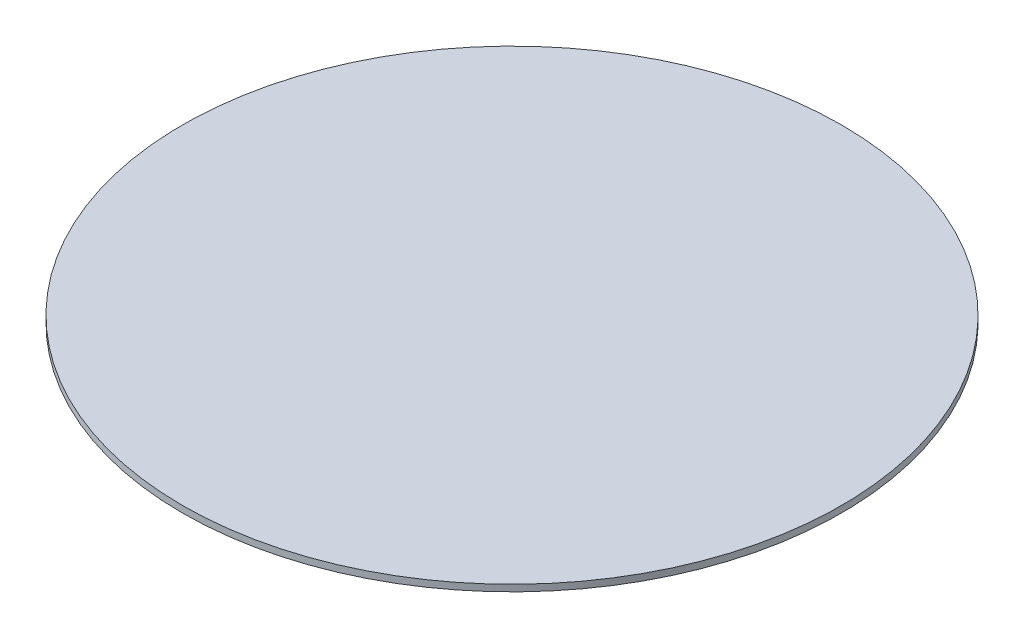
ISO-10303-21;
HEADER;
FILE_DESCRIPTION(('STEP AP214'),'2;1');
FILE_NAME('part.step','',(''),(''),'','','');
FILE_SCHEMA(('AUTOMOTIVE_DESIGN { 1 0 10303 214 1 1 1 1 }'));
ENDSEC;
DATA;
#1=APPLICATION_CONTEXT('core data for automotive mechanical design processes');
#2=APPLICATION_PROTOCOL_DEFINITION('international standard','automotive_design',2000,#1);
#3=PRODUCT_CONTEXT('',#1,'mechanical');
#4=PRODUCT('Part','Part','',(#3));
#5=PRODUCT_RELATED_PRODUCT_CATEGORY('part','',(#4));
#6=PRODUCT_DEFINITION_FORMATION('','',#4);
#7=PRODUCT_DEFINITION_CONTEXT('part definition',#1,'design');
#8=PRODUCT_DEFINITION('design','',#6,#7);
#9=PRODUCT_DEFINITION_SHAPE('','',#8);
#10=(LENGTH_UNIT() NAMED_UNIT(*) SI_UNIT(.MILLI.,.METRE.));
#11=(NAMED_UNIT(*) PLANE_ANGLE_UNIT() SI_UNIT($,.RADIAN.));
#12=(NAMED_UNIT(*) SI_UNIT($,.STERADIAN.) SOLID_ANGLE_UNIT());
#13=UNCERTAINTY_MEASURE_WITH_UNIT(LENGTH_MEASURE(1.E-05),#10,'distance_accuracy_value','');
#14=(GEOMETRIC_REPRESENTATION_CONTEXT(3) GLOBAL_UNCERTAINTY_ASSIGNED_CONTEXT((#13)) GLOBAL_UNIT_ASSIGNED_CONTEXT((#10,
#11,#12)) REPRESENTATION_CONTEXT('',''));
#15=CARTESIAN_POINT('',(0.,0.,0.));
#16=DIRECTION('',(0.,0.,1.));
#17=DIRECTION('',(1.,0.,0.));
#18=AXIS2_PLACEMENT_3D('',#15,#16,#17);
#19=CARTESIAN_POINT('',(-21.15,48.,15.5));
#20=DIRECTION('',(0.707106781186548,0.,-0.707106781186546));
#21=DIRECTION('',(-0.707106781186546,0.,-0.707106781186549));
#22=AXIS2_PLACEMENT_3D('',#19,#20,#21);
#23=PLANE('',#22);
#24=DIRECTION('',(0.707106781186546,0.,0.707106781186549));
#25=VECTOR('',#24,1.);
#26=CARTESIAN_POINT('',(-21.15,0.,15.5));
#27=LINE('',#26,#25);
#28=CARTESIAN_POINT('',(-21.15,0.,15.5));
#29=VERTEX_POINT('',#28);
#30=CARTESIAN_POINT('',(-15.5,0.,21.15));
#31=VERTEX_POINT('',#30);
#32=EDGE_CURVE('E136',#29,#31,#27,.T.);
#33=ORIENTED_EDGE('',*,*,#32,.T.);
#34=DIRECTION('',(0.,-1.,0.));
#35=VECTOR('',#34,1.);
#36=CARTESIAN_POINT('',(-15.5,48.,21.15));
#37=LINE('',#36,#35);
#38=CARTESIAN_POINT('',(-15.5,48.,21.15));
#39=VERTEX_POINT('',#38);
#40=EDGE_CURVE('E160',#39,#31,#37,.T.);
#41=ORIENTED_EDGE('',*,*,#40,.F.);
#42=DIRECTION('',(0.707106781186546,0.,0.707106781186549));
#43=VECTOR('',#42,1.);
#44=CARTESIAN_POINT('',(-21.15,48.,15.5));
#45=LINE('',#44,#43);
#46=CARTESIAN_POINT('',(-21.15,48.,15.5));
#47=VERTEX_POINT('',#46);
#48=EDGE_CURVE('E95',#47,#39,#45,.T.);
#49=ORIENTED_EDGE('',*,*,#48,.F.);
#50=DIRECTION('',(0.,-1.,0.));
#51=VECTOR('',#50,1.);
#52=CARTESIAN_POINT('',(-21.15,48.,15.5));
#53=LINE('',#52,#51);
#54=EDGE_CURVE('E36',#47,#29,#53,.T.);
#55=ORIENTED_EDGE('',*,*,#54,.T.);
#56=EDGE_LOOP('',(#33,#41,#49,#55));
#57=FACE_BOUND('',#56,.T.);
#58=ADVANCED_FACE('F33',(#57),#23,.F.);
#59=CARTESIAN_POINT('',(0.,48.,21.15));
#60=DIRECTION('',(0.,0.,-1.));
#61=DIRECTION('',(-1.,0.,0.));
#62=AXIS2_PLACEMENT_3D('',#59,#60,#61);
#63=PLANE('',#62);
#64=DIRECTION('',(1.,0.,0.));
#65=VECTOR('',#64,1.);
#66=CARTESIAN_POINT('',(0.,0.,21.15));
#67=LINE('',#66,#65);
#68=CARTESIAN_POINT('',(15.5,0.,21.15));
#69=VERTEX_POINT('',#68);
#70=EDGE_CURVE('E139',#31,#69,#67,.T.);
#71=ORIENTED_EDGE('',*,*,#70,.T.);
#72=DIRECTION('',(0.,-1.,0.));
#73=VECTOR('',#72,1.);
#74=CARTESIAN_POINT('',(15.5,48.,21.15));
#75=LINE('',#74,#73);
#76=CARTESIAN_POINT('',(15.5,48.,21.15));
#77=VERTEX_POINT('',#76);
#78=EDGE_CURVE('E158',#77,#69,#75,.T.);
#79=ORIENTED_EDGE('',*,*,#78,.F.);
#80=DIRECTION('',(1.,0.,0.));
#81=VECTOR('',#80,1.);
#82=CARTESIAN_POINT('',(0.,48.,21.15));
#83=LINE('',#82,#81);
#84=EDGE_CURVE('E172',#39,#77,#83,.T.);
#85=ORIENTED_EDGE('',*,*,#84,.F.);
#86=ORIENTED_EDGE('',*,*,#40,.T.);
#87=EDGE_LOOP('',(#71,#79,#85,#86));
#88=FACE_BOUND('',#87,.T.);
#89=ADVANCED_FACE('F189',(#88),#63,.F.);
#90=CARTESIAN_POINT('',(15.5,48.,21.15));
#91=DIRECTION('',(-0.707106781186547,0.,-0.707106781186548));
#92=DIRECTION('',(-0.707106781186548,0.,0.707106781186547));
#93=AXIS2_PLACEMENT_3D('',#90,#91,#92);
#94=PLANE('',#93);
#95=DIRECTION('',(0.707106781186548,0.,-0.707106781186547));
#96=VECTOR('',#95,1.);
#97=CARTESIAN_POINT('',(15.5,0.,21.15));
#98=LINE('',#97,#96);
#99=CARTESIAN_POINT('',(21.15,0.,15.5));
#100=VERTEX_POINT('',#99);
#101=EDGE_CURVE('E142',#69,#100,#98,.T.);
#102=ORIENTED_EDGE('',*,*,#101,.T.);
#103=DIRECTION('',(0.,-1.,0.));
#104=VECTOR('',#103,1.);
#105=CARTESIAN_POINT('',(21.15,48.,15.5));
#106=LINE('',#105,#104);
#107=CARTESIAN_POINT('',(21.15,48.,15.5));
#108=VERTEX_POINT('',#107);
#109=EDGE_CURVE('E155',#108,#100,#106,.T.);
#110=ORIENTED_EDGE('',*,*,#109,.F.);
#111=DIRECTION('',(0.707106781186548,0.,-0.707106781186547));
#112=VECTOR('',#111,1.);
#113=CARTESIAN_POINT('',(15.5,48.,21.15));
#114=LINE('',#113,#112);
#115=EDGE_CURVE('E174',#77,#108,#114,.T.);
#116=ORIENTED_EDGE('',*,*,#115,.F.);
#117=ORIENTED_EDGE('',*,*,#78,.T.);
#118=EDGE_LOOP('',(#102,#110,#116,#117));
#119=FACE_BOUND('',#118,.T.);
#120=ADVANCED_FACE('F179',(#119),#94,.F.);
#121=CARTESIAN_POINT('',(21.15,48.,0.));
#122=DIRECTION('',(-1.,0.,0.));
#123=DIRECTION('',(0.,0.,1.));
#124=AXIS2_PLACEMENT_3D('',#121,#122,#123);
#125=PLANE('',#124);
#126=DIRECTION('',(0.,0.,-1.));
#127=VECTOR('',#126,1.);
#128=CARTESIAN_POINT('',(21.15,0.,0.));
#129=LINE('',#128,#127);
#130=CARTESIAN_POINT('',(21.15,0.,-15.5));
#131=VERTEX_POINT('',#130);
#132=EDGE_CURVE('E145',#100,#131,#129,.T.);
#133=ORIENTED_EDGE('',*,*,#132,.T.);
#134=DIRECTION('',(0.,-1.,0.));
#135=VECTOR('',#134,1.);
#136=CARTESIAN_POINT('',(21.15,48.,-15.5));
#137=LINE('',#136,#135);
#138=CARTESIAN_POINT('',(21.15,48.,-15.5));
#139=VERTEX_POINT('',#138);
#140=EDGE_CURVE('E125',#139,#131,#137,.T.);
#141=ORIENTED_EDGE('',*,*,#140,.F.);
#142=DIRECTION('',(0.,0.,-1.));
#143=VECTOR('',#142,1.);
#144=CARTESIAN_POINT('',(21.15,48.,0.));
#145=LINE('',#144,#143);
#146=EDGE_CURVE('E115',#108,#139,#145,.T.);
#147=ORIENTED_EDGE('',*,*,#146,.F.);
#148=ORIENTED_EDGE('',*,*,#109,.T.);
#149=EDGE_LOOP('',(#133,#141,#147,#148));
#150=FACE_BOUND('',#149,.T.);
#151=ADVANCED_FACE('F182',(#150),#125,.F.);
#152=CARTESIAN_POINT('',(21.15,48.,-15.5));
#153=DIRECTION('',(-0.707106781186548,0.,0.707106781186547));
#154=DIRECTION('',(0.707106781186547,0.,0.707106781186548));
#155=AXIS2_PLACEMENT_3D('',#152,#153,#154);
#156=PLANE('',#155);
#157=DIRECTION('',(-0.707106781186547,0.,-0.707106781186548));
#158=VECTOR('',#157,1.);
#159=CARTESIAN_POINT('',(21.15,0.,-15.5));
#160=LINE('',#159,#158);
#161=CARTESIAN_POINT('',(15.5,0.,-21.15));
#162=VERTEX_POINT('',#161);
#163=EDGE_CURVE('E124',#131,#162,#160,.T.);
#164=ORIENTED_EDGE('',*,*,#163,.T.);
#165=DIRECTION('',(0.,-1.,0.));
#166=VECTOR('',#165,1.);
#167=CARTESIAN_POINT('',(15.5,48.,-21.15));
#168=LINE('',#167,#166);
#169=CARTESIAN_POINT('',(15.5,48.,-21.15));
#170=VERTEX_POINT('',#169);
#171=EDGE_CURVE('E121',#170,#162,#168,.T.);
#172=ORIENTED_EDGE('',*,*,#171,.F.);
#173=DIRECTION('',(-0.707106781186547,0.,-0.707106781186548));
#174=VECTOR('',#173,1.);
#175=CARTESIAN_POINT('',(21.15,48.,-15.5));
#176=LINE('',#175,#174);
#177=EDGE_CURVE('E109',#139,#170,#176,.T.);
#178=ORIENTED_EDGE('',*,*,#177,.F.);
#179=ORIENTED_EDGE('',*,*,#140,.T.);
#180=EDGE_LOOP('',(#164,#172,#178,#179));
#181=FACE_BOUND('',#180,.T.);
#182=ADVANCED_FACE('F122',(#181),#156,.F.);
#183=CARTESIAN_POINT('',(0.,48.,-21.15));
#184=DIRECTION('',(0.,0.,1.));
#185=DIRECTION('',(1.,0.,0.));
#186=AXIS2_PLACEMENT_3D('',#183,#184,#185);
#187=PLANE('',#186);
#188=DIRECTION('',(-1.,0.,0.));
#189=VECTOR('',#188,1.);
#190=CARTESIAN_POINT('',(0.,0.,-21.15));
#191=LINE('',#190,#189);
#192=CARTESIAN_POINT('',(-15.5,0.,-21.15));
#193=VERTEX_POINT('',#192);
#194=EDGE_CURVE('E80',#162,#193,#191,.T.);
#195=ORIENTED_EDGE('',*,*,#194,.T.);
#196=DIRECTION('',(0.,-1.,0.));
#197=VECTOR('',#196,1.);
#198=CARTESIAN_POINT('',(-15.5,48.,-21.15));
#199=LINE('',#198,#197);
#200=CARTESIAN_POINT('',(-15.5,48.,-21.15));
#201=VERTEX_POINT('',#200);
#202=EDGE_CURVE('E126',#201,#193,#199,.T.);
#203=ORIENTED_EDGE('',*,*,#202,.F.);
#204=DIRECTION('',(-1.,0.,0.));
#205=VECTOR('',#204,1.);
#206=CARTESIAN_POINT('',(0.,48.,-21.15));
#207=LINE('',#206,#205);
#208=EDGE_CURVE('E113',#170,#201,#207,.T.);
#209=ORIENTED_EDGE('',*,*,#208,.F.);
#210=ORIENTED_EDGE('',*,*,#171,.T.);
#211=EDGE_LOOP('',(#195,#203,#209,#210));
#212=FACE_BOUND('',#211,.T.);
#213=ADVANCED_FACE('F128',(#212),#187,.F.);
#214=CARTESIAN_POINT('',(-15.5,48.,-21.15));
#215=DIRECTION('',(0.707106781186548,0.,0.707106781186547));
#216=DIRECTION('',(0.707106781186547,0.,-0.707106781186548));
#217=AXIS2_PLACEMENT_3D('',#214,#215,#216);
#218=PLANE('',#217);
#219=DIRECTION('',(-0.707106781186547,0.,0.707106781186548));
#220=VECTOR('',#219,1.);
#221=CARTESIAN_POINT('',(-15.5,0.,-21.15));
#222=LINE('',#221,#220);
#223=CARTESIAN_POINT('',(-21.15,0.,-15.5));
#224=VERTEX_POINT('',#223);
#225=EDGE_CURVE('E87',#193,#224,#222,.T.);
#226=ORIENTED_EDGE('',*,*,#225,.T.);
#227=DIRECTION('',(0.,-1.,0.));
#228=VECTOR('',#227,1.);
#229=CARTESIAN_POINT('',(-21.15,48.,-15.5));
#230=LINE('',#229,#228);
#231=CARTESIAN_POINT('',(-21.15,48.,-15.5));
#232=VERTEX_POINT('',#231);
#233=EDGE_CURVE('E132',#232,#224,#230,.T.);
#234=ORIENTED_EDGE('',*,*,#233,.F.);
#235=DIRECTION('',(-0.707106781186547,0.,0.707106781186548));
#236=VECTOR('',#235,1.);
#237=CARTESIAN_POINT('',(-15.5,48.,-21.15));
#238=LINE('',#237,#236);
#239=EDGE_CURVE('E130',#201,#232,#238,.T.);
#240=ORIENTED_EDGE('',*,*,#239,.F.);
#241=ORIENTED_EDGE('',*,*,#202,.T.);
#242=EDGE_LOOP('',(#226,#234,#240,#241));
#243=FACE_BOUND('',#242,.T.);
#244=ADVANCED_FACE('F188',(#243),#218,.F.);
#245=CARTESIAN_POINT('',(-21.15,48.,0.));
#246=DIRECTION('',(1.,0.,0.));
#247=DIRECTION('',(0.,0.,-1.));
#248=AXIS2_PLACEMENT_3D('',#245,#246,#247);
#249=PLANE('',#248);
#250=DIRECTION('',(0.,0.,1.));
#251=VECTOR('',#250,1.);
#252=CARTESIAN_POINT('',(-21.15,0.,0.));
#253=LINE('',#252,#251);
#254=EDGE_CURVE('E150',#224,#29,#253,.T.);
#255=ORIENTED_EDGE('',*,*,#254,.T.);
#256=ORIENTED_EDGE('',*,*,#54,.F.);
#257=DIRECTION('',(0.,0.,1.));
#258=VECTOR('',#257,1.);
#259=CARTESIAN_POINT('',(-21.15,48.,0.));
#260=LINE('',#259,#258);
#261=EDGE_CURVE('E51',#232,#47,#260,.T.);
#262=ORIENTED_EDGE('',*,*,#261,.F.);
#263=ORIENTED_EDGE('',*,*,#233,.T.);
#264=EDGE_LOOP('',(#255,#256,#262,#263));
#265=FACE_BOUND('',#264,.T.);
#266=ADVANCED_FACE('F187',(#265),#249,.F.);
#267=CARTESIAN_POINT('',(0.,48.,0.));
#268=DIRECTION('',(0.,-1.,0.));
#269=DIRECTION('',(0.,0.,-1.));
#270=AXIS2_PLACEMENT_3D('',#267,#268,#269);
#271=PLANE('',#270);
#272=CARTESIAN_POINT('',(0.,48.,0.));
#273=DIRECTION('',(0.,1.,0.));
#274=DIRECTION('',(0.,0.,1.));
#275=AXIS2_PLACEMENT_3D('',#272,#273,#274);
#276=CIRCLE('',#275,11.);
#277=CARTESIAN_POINT('',(0.,48.,11.));
#278=VERTEX_POINT('',#277);
#279=EDGE_CURVE('E42',#278,#278,#276,.T.);
#280=ORIENTED_EDGE('',*,*,#279,.F.);
#281=EDGE_LOOP('',(#280));
#282=FACE_BOUND('',#281,.T.);
#283=ORIENTED_EDGE('',*,*,#261,.T.);
#284=ORIENTED_EDGE('',*,*,#48,.T.);
#285=ORIENTED_EDGE('',*,*,#84,.T.);
#286=ORIENTED_EDGE('',*,*,#115,.T.);
#287=ORIENTED_EDGE('',*,*,#146,.T.);
#288=ORIENTED_EDGE('',*,*,#177,.T.);
#289=ORIENTED_EDGE('',*,*,#208,.T.);
#290=ORIENTED_EDGE('',*,*,#239,.T.);
#291=EDGE_LOOP('',(#283,#284,#285,#286,#287,#288,#289,#290));
#292=FACE_BOUND('',#291,.T.);
#293=ADVANCED_FACE('F111',(#282,#292),#271,.F.);
#294=CARTESIAN_POINT('',(0.,0.,0.));
#295=DIRECTION('',(0.,-1.,0.));
#296=DIRECTION('',(0.,0.,-1.));
#297=AXIS2_PLACEMENT_3D('',#294,#295,#296);
#298=PLANE('',#297);
#299=ORIENTED_EDGE('',*,*,#32,.F.);
#300=ORIENTED_EDGE('',*,*,#254,.F.);
#301=ORIENTED_EDGE('',*,*,#225,.F.);
#302=ORIENTED_EDGE('',*,*,#194,.F.);
#303=ORIENTED_EDGE('',*,*,#163,.F.);
#304=ORIENTED_EDGE('',*,*,#132,.F.);
#305=ORIENTED_EDGE('',*,*,#101,.F.);
#306=ORIENTED_EDGE('',*,*,#70,.F.);
#307=EDGE_LOOP('',(#299,#300,#301,#302,#303,#304,#305,#306));
#308=FACE_BOUND('',#307,.T.);
#309=ADVANCED_FACE('F185',(#308),#298,.T.);
#310=CARTESIAN_POINT('',(0.,50.,0.));
#311=DIRECTION('',(0.,-1.,0.));
#312=DIRECTION('',(0.,0.,-1.));
#313=AXIS2_PLACEMENT_3D('',#310,#311,#312);
#314=CYLINDRICAL_SURFACE('',#313,11.);
#315=CARTESIAN_POINT('',(0.,50.,0.));
#316=DIRECTION('',(0.,1.,0.));
#317=DIRECTION('',(0.,0.,1.));
#318=AXIS2_PLACEMENT_3D('',#315,#316,#317);
#319=CIRCLE('',#318,11.);
#320=CARTESIAN_POINT('',(0.,50.,11.));
#321=VERTEX_POINT('',#320);
#322=EDGE_CURVE('E140',#321,#321,#319,.T.);
#323=ORIENTED_EDGE('',*,*,#322,.F.);
#324=EDGE_LOOP('',(#323));
#325=FACE_BOUND('',#324,.T.);
#326=ORIENTED_EDGE('',*,*,#279,.T.);
#327=EDGE_LOOP('',(#326));
#328=FACE_BOUND('',#327,.T.);
#329=ADVANCED_FACE('F209',(#325,#328),#314,.T.);
#330=CARTESIAN_POINT('',(0.,50.,0.));
#331=DIRECTION('',(0.,1.,0.));
#332=DIRECTION('',(0.,0.,1.));
#333=AXIS2_PLACEMENT_3D('',#330,#331,#332);
#334=PLANE('',#333);
#335=CARTESIAN_POINT('',(0.,50.,0.));
#336=DIRECTION('',(0.,1.,0.));
#337=DIRECTION('',(0.,0.,1.));
#338=AXIS2_PLACEMENT_3D('',#335,#336,#337);
#339=CIRCLE('',#338,2.5);
#340=CARTESIAN_POINT('',(0.,50.,2.5));
#341=VERTEX_POINT('',#340);
#342=EDGE_CURVE('E11',#341,#341,#339,.T.);
#343=ORIENTED_EDGE('',*,*,#342,.F.);
#344=EDGE_LOOP('',(#343));
#345=FACE_BOUND('',#344,.T.);
#346=ORIENTED_EDGE('',*,*,#322,.T.);
#347=EDGE_LOOP('',(#346));
#348=FACE_BOUND('',#347,.T.);
#349=ADVANCED_FACE('F215',(#345,#348),#334,.T.);
#350=CARTESIAN_POINT('',(0.,68.,0.));
#351=DIRECTION('',(0.,-1.,0.));
#352=DIRECTION('',(0.,0.,-1.));
#353=AXIS2_PLACEMENT_3D('',#350,#351,#352);
#354=CYLINDRICAL_SURFACE('',#353,2.5);
#355=CARTESIAN_POINT('',(0.,68.,0.));
#356=DIRECTION('',(0.,1.,0.));
#357=DIRECTION('',(0.,0.,1.));
#358=AXIS2_PLACEMENT_3D('',#355,#356,#357);
#359=CIRCLE('',#358,2.5);
#360=CARTESIAN_POINT('',(0.,68.,2.5));
#361=VERTEX_POINT('',#360);
#362=EDGE_CURVE('E240',#361,#361,#359,.T.);
#363=ORIENTED_EDGE('',*,*,#362,.F.);
#364=EDGE_LOOP('',(#363));
#365=FACE_BOUND('',#364,.T.);
#366=ORIENTED_EDGE('',*,*,#342,.T.);
#367=EDGE_LOOP('',(#366));
#368=FACE_BOUND('',#367,.T.);
#369=ADVANCED_FACE('F219',(#365,#368),#354,.T.);
#370=CARTESIAN_POINT('',(0.,72.,0.));
#371=DIRECTION('',(0.,-1.,0.));
#372=DIRECTION('',(0.,0.,-1.));
#373=AXIS2_PLACEMENT_3D('',#370,#371,#372);
#374=CYLINDRICAL_SURFACE('',#373,200.);
#375=CARTESIAN_POINT('',(0.,72.,0.));
#376=DIRECTION('',(0.,1.,0.));
#377=DIRECTION('',(0.,0.,1.));
#378=AXIS2_PLACEMENT_3D('',#375,#376,#377);
#379=CIRCLE('',#378,200.);
#380=CARTESIAN_POINT('',(0.,72.,200.));
#381=VERTEX_POINT('',#380);
#382=EDGE_CURVE('E239',#381,#381,#379,.T.);
#383=ORIENTED_EDGE('',*,*,#382,.F.);
#384=EDGE_LOOP('',(#383));
#385=FACE_BOUND('',#384,.T.);
#386=CARTESIAN_POINT('',(0.,68.,0.));
#387=DIRECTION('',(0.,1.,0.));
#388=DIRECTION('',(0.,0.,1.));
#389=AXIS2_PLACEMENT_3D('',#386,#387,#388);
#390=CIRCLE('',#389,200.);
#391=CARTESIAN_POINT('',(0.,68.,200.));
#392=VERTEX_POINT('',#391);
#393=EDGE_CURVE('E241',#392,#392,#390,.T.);
#394=ORIENTED_EDGE('',*,*,#393,.T.);
#395=EDGE_LOOP('',(#394));
#396=FACE_BOUND('',#395,.T.);
#397=ADVANCED_FACE('F223',(#385,#396),#374,.T.);
#398=CARTESIAN_POINT('',(0.,72.,0.));
#399=DIRECTION('',(0.,1.,0.));
#400=DIRECTION('',(0.,0.,1.));
#401=AXIS2_PLACEMENT_3D('',#398,#399,#400);
#402=PLANE('',#401);
#403=ORIENTED_EDGE('',*,*,#382,.T.);
#404=EDGE_LOOP('',(#403));
#405=FACE_BOUND('',#404,.T.);
#406=ADVANCED_FACE('F227',(#405),#402,.T.);
#407=CARTESIAN_POINT('',(0.,68.,0.));
#408=DIRECTION('',(0.,1.,0.));
#409=DIRECTION('',(0.,0.,1.));
#410=AXIS2_PLACEMENT_3D('',#407,#408,#409);
#411=PLANE('',#410);
#412=ORIENTED_EDGE('',*,*,#362,.T.);
#413=EDGE_LOOP('',(#412));
#414=FACE_BOUND('',#413,.T.);
#415=ORIENTED_EDGE('',*,*,#393,.F.);
#416=EDGE_LOOP('',(#415));
#417=FACE_BOUND('',#416,.T.);
#418=ADVANCED_FACE('F229',(#414,#417),#411,.F.);
#419=CLOSED_SHELL('',(#58,#89,#120,#151,#182,#213,#244,#266,#293,#309,#329,#349,#369,#397,#406,#418));
#420=MANIFOLD_SOLID_BREP('B2',#419);
#421=ADVANCED_BREP_SHAPE_REPRESENTATION('',(#18,#420),#14);
#422=SHAPE_DEFINITION_REPRESENTATION(#9,#421);
ENDSEC;
END-ISO-10303-21;
